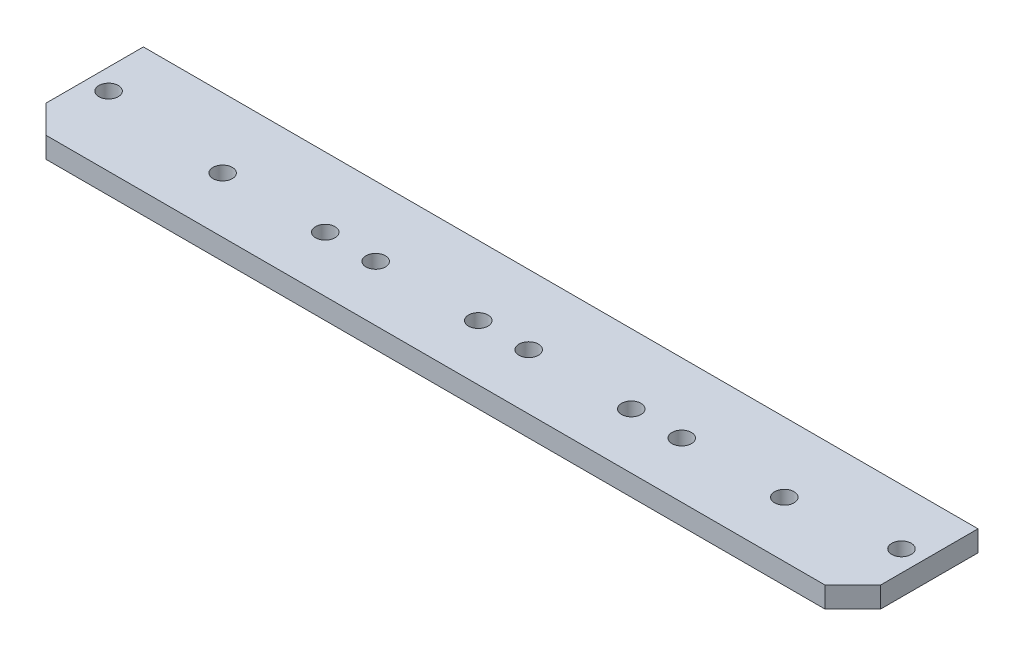
ISO-10303-21;
HEADER;
FILE_DESCRIPTION(('STEP AP214'),'2;1');
FILE_NAME('part.step','',(''),(''),'','','');
FILE_SCHEMA(('AUTOMOTIVE_DESIGN { 1 0 10303 214 1 1 1 1 }'));
ENDSEC;
DATA;
#1=APPLICATION_CONTEXT('core data for automotive mechanical design processes');
#2=APPLICATION_PROTOCOL_DEFINITION('international standard','automotive_design',2000,#1);
#3=PRODUCT_CONTEXT('',#1,'mechanical');
#4=PRODUCT('Part','Part','',(#3));
#5=PRODUCT_RELATED_PRODUCT_CATEGORY('part','',(#4));
#6=PRODUCT_DEFINITION_FORMATION('','',#4);
#7=PRODUCT_DEFINITION_CONTEXT('part definition',#1,'design');
#8=PRODUCT_DEFINITION('design','',#6,#7);
#9=PRODUCT_DEFINITION_SHAPE('','',#8);
#10=(LENGTH_UNIT() NAMED_UNIT(*) SI_UNIT(.MILLI.,.METRE.));
#11=(NAMED_UNIT(*) PLANE_ANGLE_UNIT() SI_UNIT($,.RADIAN.));
#12=(NAMED_UNIT(*) SI_UNIT($,.STERADIAN.) SOLID_ANGLE_UNIT());
#13=UNCERTAINTY_MEASURE_WITH_UNIT(LENGTH_MEASURE(1.E-05),#10,'distance_accuracy_value','');
#14=(GEOMETRIC_REPRESENTATION_CONTEXT(3) GLOBAL_UNCERTAINTY_ASSIGNED_CONTEXT((#13)) GLOBAL_UNIT_ASSIGNED_CONTEXT((#10,
#11,#12)) REPRESENTATION_CONTEXT('',''));
#15=CARTESIAN_POINT('',(0.,0.,0.));
#16=DIRECTION('',(0.,0.,1.));
#17=DIRECTION('',(1.,0.,0.));
#18=AXIS2_PLACEMENT_3D('',#15,#16,#17);
#19=CARTESIAN_POINT('',(60.,3.,-17.5));
#20=DIRECTION('',(-1.,0.,0.));
#21=DIRECTION('',(0.,0.,1.));
#22=AXIS2_PLACEMENT_3D('',#19,#20,#21);
#23=PLANE('',#22);
#24=DIRECTION('',(0.,0.,-1.));
#25=VECTOR('',#24,1.);
#26=CARTESIAN_POINT('',(60.,0.,-17.5));
#27=LINE('',#26,#25);
#28=CARTESIAN_POINT('',(60.,0.,13.5));
#29=VERTEX_POINT('',#28);
#30=CARTESIAN_POINT('',(60.,0.,-0.499999999999995));
#31=VERTEX_POINT('',#30);
#32=EDGE_CURVE('E99',#29,#31,#27,.T.);
#33=ORIENTED_EDGE('',*,*,#32,.T.);
#34=DIRECTION('',(0.,1.,0.));
#35=VECTOR('',#34,1.);
#36=CARTESIAN_POINT('',(60.,0.,-0.499999999999995));
#37=LINE('',#36,#35);
#38=CARTESIAN_POINT('',(60.,3.,-0.499999999999995));
#39=VERTEX_POINT('',#38);
#40=EDGE_CURVE('E94',#31,#39,#37,.T.);
#41=ORIENTED_EDGE('',*,*,#40,.T.);
#42=DIRECTION('',(0.,0.,-1.));
#43=VECTOR('',#42,1.);
#44=CARTESIAN_POINT('',(60.,3.,-17.5));
#45=LINE('',#44,#43);
#46=CARTESIAN_POINT('',(60.,3.,13.5));
#47=VERTEX_POINT('',#46);
#48=EDGE_CURVE('E113',#47,#39,#45,.T.);
#49=ORIENTED_EDGE('',*,*,#48,.F.);
#50=DIRECTION('',(0.,-1.,0.));
#51=VECTOR('',#50,1.);
#52=CARTESIAN_POINT('',(60.,3.,13.5));
#53=LINE('',#52,#51);
#54=EDGE_CURVE('E118',#47,#29,#53,.T.);
#55=ORIENTED_EDGE('',*,*,#54,.T.);
#56=EDGE_LOOP('',(#33,#41,#49,#55));
#57=FACE_BOUND('',#56,.T.);
#58=ADVANCED_FACE('F35',(#57),#23,.F.);
#59=CARTESIAN_POINT('',(-60.,3.,-17.5));
#60=DIRECTION('',(1.,0.,0.));
#61=DIRECTION('',(0.,0.,-1.));
#62=AXIS2_PLACEMENT_3D('',#59,#60,#61);
#63=PLANE('',#62);
#64=DIRECTION('',(0.,0.,1.));
#65=VECTOR('',#64,1.);
#66=CARTESIAN_POINT('',(-60.,3.,-17.5));
#67=LINE('',#66,#65);
#68=CARTESIAN_POINT('',(-60.,3.,-0.499999999999995));
#69=VERTEX_POINT('',#68);
#70=CARTESIAN_POINT('',(-60.,3.,13.5));
#71=VERTEX_POINT('',#70);
#72=EDGE_CURVE('E50',#69,#71,#67,.T.);
#73=ORIENTED_EDGE('',*,*,#72,.F.);
#74=DIRECTION('',(0.,1.,0.));
#75=VECTOR('',#74,1.);
#76=CARTESIAN_POINT('',(-60.,0.,-0.499999999999995));
#77=LINE('',#76,#75);
#78=CARTESIAN_POINT('',(-60.,0.,-0.499999999999995));
#79=VERTEX_POINT('',#78);
#80=EDGE_CURVE('E92',#79,#69,#77,.T.);
#81=ORIENTED_EDGE('',*,*,#80,.F.);
#82=DIRECTION('',(0.,0.,1.));
#83=VECTOR('',#82,1.);
#84=CARTESIAN_POINT('',(-60.,0.,-17.5));
#85=LINE('',#84,#83);
#86=CARTESIAN_POINT('',(-60.,0.,13.5));
#87=VERTEX_POINT('',#86);
#88=EDGE_CURVE('E104',#79,#87,#85,.T.);
#89=ORIENTED_EDGE('',*,*,#88,.T.);
#90=DIRECTION('',(0.,1.,0.));
#91=VECTOR('',#90,1.);
#92=CARTESIAN_POINT('',(-60.,3.,13.5));
#93=LINE('',#92,#91);
#94=EDGE_CURVE('E11',#87,#71,#93,.T.);
#95=ORIENTED_EDGE('',*,*,#94,.T.);
#96=EDGE_LOOP('',(#73,#81,#89,#95));
#97=FACE_BOUND('',#96,.T.);
#98=ADVANCED_FACE('F103',(#97),#63,.F.);
#99=CARTESIAN_POINT('',(-60.,3.,17.5));
#100=DIRECTION('',(0.,0.,-1.));
#101=DIRECTION('',(-1.,0.,0.));
#102=AXIS2_PLACEMENT_3D('',#99,#100,#101);
#103=PLANE('',#102);
#104=DIRECTION('',(1.,0.,0.));
#105=VECTOR('',#104,1.);
#106=CARTESIAN_POINT('',(-60.,0.,17.5));
#107=LINE('',#106,#105);
#108=CARTESIAN_POINT('',(-56.,0.,17.5));
#109=VERTEX_POINT('',#108);
#110=CARTESIAN_POINT('',(56.,0.,17.5));
#111=VERTEX_POINT('',#110);
#112=EDGE_CURVE('E111',#109,#111,#107,.T.);
#113=ORIENTED_EDGE('',*,*,#112,.T.);
#114=DIRECTION('',(0.,1.,0.));
#115=VECTOR('',#114,1.);
#116=CARTESIAN_POINT('',(56.,3.,17.5));
#117=LINE('',#116,#115);
#118=CARTESIAN_POINT('',(56.,3.,17.5));
#119=VERTEX_POINT('',#118);
#120=EDGE_CURVE('E57',#111,#119,#117,.T.);
#121=ORIENTED_EDGE('',*,*,#120,.T.);
#122=DIRECTION('',(1.,0.,0.));
#123=VECTOR('',#122,1.);
#124=CARTESIAN_POINT('',(-60.,3.,17.5));
#125=LINE('',#124,#123);
#126=CARTESIAN_POINT('',(-56.,3.,17.5));
#127=VERTEX_POINT('',#126);
#128=EDGE_CURVE('E121',#127,#119,#125,.T.);
#129=ORIENTED_EDGE('',*,*,#128,.F.);
#130=DIRECTION('',(0.,-1.,0.));
#131=VECTOR('',#130,1.);
#132=CARTESIAN_POINT('',(-56.,3.,17.5));
#133=LINE('',#132,#131);
#134=EDGE_CURVE('E125',#127,#109,#133,.T.);
#135=ORIENTED_EDGE('',*,*,#134,.T.);
#136=EDGE_LOOP('',(#113,#121,#129,#135));
#137=FACE_BOUND('',#136,.T.);
#138=ADVANCED_FACE('F140',(#137),#103,.F.);
#139=CARTESIAN_POINT('',(0.,3.,0.));
#140=DIRECTION('',(0.,1.,0.));
#141=DIRECTION('',(0.,0.,1.));
#142=AXIS2_PLACEMENT_3D('',#139,#140,#141);
#143=PLANE('',#142);
#144=DIRECTION('',(1.,0.,0.));
#145=VECTOR('',#144,1.);
#146=CARTESIAN_POINT('',(-15.,3.,-0.499999999999993));
#147=LINE('',#146,#145);
#148=EDGE_CURVE('E100',#69,#39,#147,.T.);
#149=ORIENTED_EDGE('',*,*,#148,.F.);
#150=ORIENTED_EDGE('',*,*,#72,.T.);
#151=DIRECTION('',(-0.707106781186546,0.,-0.707106781186549));
#152=VECTOR('',#151,1.);
#153=CARTESIAN_POINT('',(-36.7500000000001,3.,36.75));
#154=LINE('',#153,#152);
#155=EDGE_CURVE('E129',#71,#127,#154,.F.);
#156=ORIENTED_EDGE('',*,*,#155,.T.);
#157=ORIENTED_EDGE('',*,*,#128,.T.);
#158=DIRECTION('',(-0.707106781186549,0.,0.707106781186546));
#159=VECTOR('',#158,1.);
#160=CARTESIAN_POINT('',(36.7499999999999,3.,36.75));
#161=LINE('',#160,#159);
#162=EDGE_CURVE('E43',#119,#47,#161,.F.);
#163=ORIENTED_EDGE('',*,*,#162,.T.);
#164=ORIENTED_EDGE('',*,*,#48,.T.);
#165=EDGE_LOOP('',(#149,#150,#156,#157,#163,#164));
#166=FACE_BOUND('',#165,.T.);
#167=CARTESIAN_POINT('',(20.15,3.,9.5));
#168=DIRECTION('',(0.,1.,0.));
#169=DIRECTION('',(0.,0.,1.));
#170=AXIS2_PLACEMENT_3D('',#167,#168,#169);
#171=CIRCLE('',#170,1.4);
#172=CARTESIAN_POINT('',(20.15,3.,10.9));
#173=VERTEX_POINT('',#172);
#174=EDGE_CURVE('E211',#173,#173,#171,.T.);
#175=ORIENTED_EDGE('',*,*,#174,.F.);
#176=EDGE_LOOP('',(#175));
#177=FACE_BOUND('',#176,.T.);
#178=CARTESIAN_POINT('',(27.4,3.,9.50000000000001));
#179=DIRECTION('',(0.,1.,0.));
#180=DIRECTION('',(0.,0.,1.));
#181=AXIS2_PLACEMENT_3D('',#178,#179,#180);
#182=CIRCLE('',#181,1.4);
#183=CARTESIAN_POINT('',(27.4,3.,10.9));
#184=VERTEX_POINT('',#183);
#185=EDGE_CURVE('E217',#184,#184,#182,.T.);
#186=ORIENTED_EDGE('',*,*,#185,.F.);
#187=EDGE_LOOP('',(#186));
#188=FACE_BOUND('',#187,.T.);
#189=CARTESIAN_POINT('',(42.15,3.,9.50000000000001));
#190=DIRECTION('',(0.,1.,0.));
#191=DIRECTION('',(0.,0.,1.));
#192=AXIS2_PLACEMENT_3D('',#189,#190,#191);
#193=CIRCLE('',#192,1.4);
#194=CARTESIAN_POINT('',(42.15,3.,10.9));
#195=VERTEX_POINT('',#194);
#196=EDGE_CURVE('E225',#195,#195,#193,.T.);
#197=ORIENTED_EDGE('',*,*,#196,.F.);
#198=EDGE_LOOP('',(#197));
#199=FACE_BOUND('',#198,.T.);
#200=CARTESIAN_POINT('',(-1.85,3.,9.5));
#201=DIRECTION('',(0.,1.,0.));
#202=DIRECTION('',(0.,0.,1.));
#203=AXIS2_PLACEMENT_3D('',#200,#201,#202);
#204=CIRCLE('',#203,1.4);
#205=CARTESIAN_POINT('',(-1.85,3.,10.9));
#206=VERTEX_POINT('',#205);
#207=EDGE_CURVE('E231',#206,#206,#204,.T.);
#208=ORIENTED_EDGE('',*,*,#207,.F.);
#209=EDGE_LOOP('',(#208));
#210=FACE_BOUND('',#209,.T.);
#211=CARTESIAN_POINT('',(-16.6,3.,9.50000000000001));
#212=DIRECTION('',(0.,1.,0.));
#213=DIRECTION('',(0.,0.,1.));
#214=AXIS2_PLACEMENT_3D('',#211,#212,#213);
#215=CIRCLE('',#214,1.4);
#216=CARTESIAN_POINT('',(-16.6,3.,10.9));
#217=VERTEX_POINT('',#216);
#218=EDGE_CURVE('E237',#217,#217,#215,.T.);
#219=ORIENTED_EDGE('',*,*,#218,.F.);
#220=EDGE_LOOP('',(#219));
#221=FACE_BOUND('',#220,.T.);
#222=CARTESIAN_POINT('',(-23.85,3.,9.50000000000001));
#223=DIRECTION('',(0.,1.,0.));
#224=DIRECTION('',(0.,0.,1.));
#225=AXIS2_PLACEMENT_3D('',#222,#223,#224);
#226=CIRCLE('',#225,1.4);
#227=CARTESIAN_POINT('',(-23.85,3.,10.9));
#228=VERTEX_POINT('',#227);
#229=EDGE_CURVE('E243',#228,#228,#226,.T.);
#230=ORIENTED_EDGE('',*,*,#229,.F.);
#231=EDGE_LOOP('',(#230));
#232=FACE_BOUND('',#231,.T.);
#233=CARTESIAN_POINT('',(-38.6,3.,9.5));
#234=DIRECTION('',(0.,1.,0.));
#235=DIRECTION('',(0.,0.,1.));
#236=AXIS2_PLACEMENT_3D('',#233,#234,#235);
#237=CIRCLE('',#236,1.4);
#238=CARTESIAN_POINT('',(-38.6,3.,10.9));
#239=VERTEX_POINT('',#238);
#240=EDGE_CURVE('E249',#239,#239,#237,.T.);
#241=ORIENTED_EDGE('',*,*,#240,.F.);
#242=EDGE_LOOP('',(#241));
#243=FACE_BOUND('',#242,.T.);
#244=CARTESIAN_POINT('',(5.4,3.,9.50000000000001));
#245=DIRECTION('',(0.,1.,0.));
#246=DIRECTION('',(0.,0.,1.));
#247=AXIS2_PLACEMENT_3D('',#244,#245,#246);
#248=CIRCLE('',#247,1.4);
#249=CARTESIAN_POINT('',(5.4,3.,10.9));
#250=VERTEX_POINT('',#249);
#251=EDGE_CURVE('E214',#250,#250,#248,.T.);
#252=ORIENTED_EDGE('',*,*,#251,.F.);
#253=EDGE_LOOP('',(#252));
#254=FACE_BOUND('',#253,.T.);
#255=CARTESIAN_POINT('',(-57.,3.,7.50000000000001));
#256=DIRECTION('',(0.,1.,0.));
#257=DIRECTION('',(0.,0.,1.));
#258=AXIS2_PLACEMENT_3D('',#255,#256,#257);
#259=CIRCLE('',#258,1.4);
#260=CARTESIAN_POINT('',(-57.,3.,8.9));
#261=VERTEX_POINT('',#260);
#262=EDGE_CURVE('E261',#261,#261,#259,.T.);
#263=ORIENTED_EDGE('',*,*,#262,.F.);
#264=EDGE_LOOP('',(#263));
#265=FACE_BOUND('',#264,.T.);
#266=CARTESIAN_POINT('',(57.,3.,7.50000000000001));
#267=DIRECTION('',(0.,1.,0.));
#268=DIRECTION('',(0.,0.,-1.));
#269=AXIS2_PLACEMENT_3D('',#266,#267,#268);
#270=CIRCLE('',#269,1.4);
#271=CARTESIAN_POINT('',(57.,3.,6.10000000000001));
#272=VERTEX_POINT('',#271);
#273=EDGE_CURVE('E255',#272,#272,#270,.T.);
#274=ORIENTED_EDGE('',*,*,#273,.F.);
#275=EDGE_LOOP('',(#274));
#276=FACE_BOUND('',#275,.T.);
#277=ADVANCED_FACE('F133',(#166,#177,#188,#199,#210,#221,#232,#243,#254,#265,#276),#143,.T.);
#278=CARTESIAN_POINT('',(0.,0.,0.));
#279=DIRECTION('',(0.,1.,0.));
#280=DIRECTION('',(0.,0.,1.));
#281=AXIS2_PLACEMENT_3D('',#278,#279,#280);
#282=PLANE('',#281);
#283=CARTESIAN_POINT('',(20.15,0.,9.5));
#284=DIRECTION('',(0.,1.,0.));
#285=DIRECTION('',(0.,0.,1.));
#286=AXIS2_PLACEMENT_3D('',#283,#284,#285);
#287=CIRCLE('',#286,1.4);
#288=CARTESIAN_POINT('',(20.15,0.,10.9));
#289=VERTEX_POINT('',#288);
#290=EDGE_CURVE('E208',#289,#289,#287,.T.);
#291=ORIENTED_EDGE('',*,*,#290,.T.);
#292=EDGE_LOOP('',(#291));
#293=FACE_BOUND('',#292,.T.);
#294=CARTESIAN_POINT('',(27.4,0.,9.50000000000001));
#295=DIRECTION('',(0.,1.,0.));
#296=DIRECTION('',(0.,0.,1.));
#297=AXIS2_PLACEMENT_3D('',#294,#295,#296);
#298=CIRCLE('',#297,1.4);
#299=CARTESIAN_POINT('',(27.4,0.,10.9));
#300=VERTEX_POINT('',#299);
#301=EDGE_CURVE('E212',#300,#300,#298,.T.);
#302=ORIENTED_EDGE('',*,*,#301,.T.);
#303=EDGE_LOOP('',(#302));
#304=FACE_BOUND('',#303,.T.);
#305=CARTESIAN_POINT('',(42.15,0.,9.50000000000001));
#306=DIRECTION('',(0.,1.,0.));
#307=DIRECTION('',(0.,0.,1.));
#308=AXIS2_PLACEMENT_3D('',#305,#306,#307);
#309=CIRCLE('',#308,1.4);
#310=CARTESIAN_POINT('',(42.15,0.,10.9));
#311=VERTEX_POINT('',#310);
#312=EDGE_CURVE('E222',#311,#311,#309,.T.);
#313=ORIENTED_EDGE('',*,*,#312,.T.);
#314=EDGE_LOOP('',(#313));
#315=FACE_BOUND('',#314,.T.);
#316=CARTESIAN_POINT('',(-1.85,0.,9.5));
#317=DIRECTION('',(0.,1.,0.));
#318=DIRECTION('',(0.,0.,1.));
#319=AXIS2_PLACEMENT_3D('',#316,#317,#318);
#320=CIRCLE('',#319,1.4);
#321=CARTESIAN_POINT('',(-1.85,0.,10.9));
#322=VERTEX_POINT('',#321);
#323=EDGE_CURVE('E228',#322,#322,#320,.T.);
#324=ORIENTED_EDGE('',*,*,#323,.T.);
#325=EDGE_LOOP('',(#324));
#326=FACE_BOUND('',#325,.T.);
#327=CARTESIAN_POINT('',(-16.6,0.,9.50000000000001));
#328=DIRECTION('',(0.,1.,0.));
#329=DIRECTION('',(0.,0.,1.));
#330=AXIS2_PLACEMENT_3D('',#327,#328,#329);
#331=CIRCLE('',#330,1.4);
#332=CARTESIAN_POINT('',(-16.6,0.,10.9));
#333=VERTEX_POINT('',#332);
#334=EDGE_CURVE('E234',#333,#333,#331,.T.);
#335=ORIENTED_EDGE('',*,*,#334,.T.);
#336=EDGE_LOOP('',(#335));
#337=FACE_BOUND('',#336,.T.);
#338=CARTESIAN_POINT('',(-23.85,0.,9.50000000000001));
#339=DIRECTION('',(0.,1.,0.));
#340=DIRECTION('',(0.,0.,1.));
#341=AXIS2_PLACEMENT_3D('',#338,#339,#340);
#342=CIRCLE('',#341,1.4);
#343=CARTESIAN_POINT('',(-23.85,0.,10.9));
#344=VERTEX_POINT('',#343);
#345=EDGE_CURVE('E240',#344,#344,#342,.T.);
#346=ORIENTED_EDGE('',*,*,#345,.T.);
#347=EDGE_LOOP('',(#346));
#348=FACE_BOUND('',#347,.T.);
#349=CARTESIAN_POINT('',(-38.6,0.,9.5));
#350=DIRECTION('',(0.,1.,0.));
#351=DIRECTION('',(0.,0.,1.));
#352=AXIS2_PLACEMENT_3D('',#349,#350,#351);
#353=CIRCLE('',#352,1.4);
#354=CARTESIAN_POINT('',(-38.6,0.,10.9));
#355=VERTEX_POINT('',#354);
#356=EDGE_CURVE('E246',#355,#355,#353,.T.);
#357=ORIENTED_EDGE('',*,*,#356,.T.);
#358=EDGE_LOOP('',(#357));
#359=FACE_BOUND('',#358,.T.);
#360=CARTESIAN_POINT('',(5.4,0.,9.50000000000001));
#361=DIRECTION('',(0.,1.,0.));
#362=DIRECTION('',(0.,0.,1.));
#363=AXIS2_PLACEMENT_3D('',#360,#361,#362);
#364=CIRCLE('',#363,1.4);
#365=CARTESIAN_POINT('',(5.4,0.,10.9));
#366=VERTEX_POINT('',#365);
#367=EDGE_CURVE('E252',#366,#366,#364,.T.);
#368=ORIENTED_EDGE('',*,*,#367,.T.);
#369=EDGE_LOOP('',(#368));
#370=FACE_BOUND('',#369,.T.);
#371=CARTESIAN_POINT('',(-57.,0.,7.50000000000001));
#372=DIRECTION('',(0.,1.,0.));
#373=DIRECTION('',(0.,0.,1.));
#374=AXIS2_PLACEMENT_3D('',#371,#372,#373);
#375=CIRCLE('',#374,1.4);
#376=CARTESIAN_POINT('',(-57.,0.,8.9));
#377=VERTEX_POINT('',#376);
#378=EDGE_CURVE('E258',#377,#377,#375,.T.);
#379=ORIENTED_EDGE('',*,*,#378,.T.);
#380=EDGE_LOOP('',(#379));
#381=FACE_BOUND('',#380,.T.);
#382=CARTESIAN_POINT('',(57.,0.,7.50000000000001));
#383=DIRECTION('',(0.,1.,0.));
#384=DIRECTION('',(0.,0.,-1.));
#385=AXIS2_PLACEMENT_3D('',#382,#383,#384);
#386=CIRCLE('',#385,1.4);
#387=CARTESIAN_POINT('',(57.,0.,6.10000000000001));
#388=VERTEX_POINT('',#387);
#389=EDGE_CURVE('E264',#388,#388,#386,.T.);
#390=ORIENTED_EDGE('',*,*,#389,.T.);
#391=EDGE_LOOP('',(#390));
#392=FACE_BOUND('',#391,.T.);
#393=ORIENTED_EDGE('',*,*,#88,.F.);
#394=DIRECTION('',(1.,0.,0.));
#395=VECTOR('',#394,1.);
#396=CARTESIAN_POINT('',(-15.,0.,-0.499999999999993));
#397=LINE('',#396,#395);
#398=EDGE_CURVE('E89',#79,#31,#397,.T.);
#399=ORIENTED_EDGE('',*,*,#398,.T.);
#400=ORIENTED_EDGE('',*,*,#32,.F.);
#401=DIRECTION('',(0.707106781186549,0.,-0.707106781186546));
#402=VECTOR('',#401,1.);
#403=CARTESIAN_POINT('',(60.,0.,13.5));
#404=LINE('',#403,#402);
#405=EDGE_CURVE('E123',#29,#111,#404,.F.);
#406=ORIENTED_EDGE('',*,*,#405,.T.);
#407=ORIENTED_EDGE('',*,*,#112,.F.);
#408=DIRECTION('',(0.707106781186546,0.,0.707106781186549));
#409=VECTOR('',#408,1.);
#410=CARTESIAN_POINT('',(-56.,0.,17.5));
#411=LINE('',#410,#409);
#412=EDGE_CURVE('E109',#109,#87,#411,.F.);
#413=ORIENTED_EDGE('',*,*,#412,.T.);
#414=EDGE_LOOP('',(#393,#399,#400,#406,#407,#413));
#415=FACE_BOUND('',#414,.T.);
#416=ADVANCED_FACE('F107',(#293,#304,#315,#326,#337,#348,#359,#370,#381,#392,#415),#282,.F.);
#417=CARTESIAN_POINT('',(-15.,0.,-0.499999999999993));
#418=DIRECTION('',(0.,0.,1.));
#419=DIRECTION('',(1.,0.,0.));
#420=AXIS2_PLACEMENT_3D('',#417,#418,#419);
#421=PLANE('',#420);
#422=ORIENTED_EDGE('',*,*,#148,.T.);
#423=ORIENTED_EDGE('',*,*,#40,.F.);
#424=ORIENTED_EDGE('',*,*,#398,.F.);
#425=ORIENTED_EDGE('',*,*,#80,.T.);
#426=EDGE_LOOP('',(#422,#423,#424,#425));
#427=FACE_BOUND('',#426,.T.);
#428=ADVANCED_FACE('F91',(#427),#421,.F.);
#429=CARTESIAN_POINT('',(57.,0.,7.50000000000001));
#430=DIRECTION('',(0.,1.,0.));
#431=DIRECTION('',(0.,0.,1.));
#432=AXIS2_PLACEMENT_3D('',#429,#430,#431);
#433=CYLINDRICAL_SURFACE('',#432,1.4);
#434=ORIENTED_EDGE('',*,*,#389,.F.);
#435=EDGE_LOOP('',(#434));
#436=FACE_BOUND('',#435,.T.);
#437=ORIENTED_EDGE('',*,*,#273,.T.);
#438=EDGE_LOOP('',(#437));
#439=FACE_BOUND('',#438,.T.);
#440=ADVANCED_FACE('F165',(#436,#439),#433,.F.);
#441=CARTESIAN_POINT('',(-57.,0.,7.50000000000001));
#442=DIRECTION('',(0.,1.,0.));
#443=DIRECTION('',(0.,0.,1.));
#444=AXIS2_PLACEMENT_3D('',#441,#442,#443);
#445=CYLINDRICAL_SURFACE('',#444,1.4);
#446=ORIENTED_EDGE('',*,*,#378,.F.);
#447=EDGE_LOOP('',(#446));
#448=FACE_BOUND('',#447,.T.);
#449=ORIENTED_EDGE('',*,*,#262,.T.);
#450=EDGE_LOOP('',(#449));
#451=FACE_BOUND('',#450,.T.);
#452=ADVANCED_FACE('F168',(#448,#451),#445,.F.);
#453=CARTESIAN_POINT('',(5.4,0.,9.50000000000001));
#454=DIRECTION('',(0.,1.,0.));
#455=DIRECTION('',(0.,0.,1.));
#456=AXIS2_PLACEMENT_3D('',#453,#454,#455);
#457=CYLINDRICAL_SURFACE('',#456,1.4);
#458=ORIENTED_EDGE('',*,*,#367,.F.);
#459=EDGE_LOOP('',(#458));
#460=FACE_BOUND('',#459,.T.);
#461=ORIENTED_EDGE('',*,*,#251,.T.);
#462=EDGE_LOOP('',(#461));
#463=FACE_BOUND('',#462,.T.);
#464=ADVANCED_FACE('F172',(#460,#463),#457,.F.);
#465=CARTESIAN_POINT('',(-38.6,0.,9.5));
#466=DIRECTION('',(0.,1.,0.));
#467=DIRECTION('',(0.,0.,1.));
#468=AXIS2_PLACEMENT_3D('',#465,#466,#467);
#469=CYLINDRICAL_SURFACE('',#468,1.4);
#470=ORIENTED_EDGE('',*,*,#356,.F.);
#471=EDGE_LOOP('',(#470));
#472=FACE_BOUND('',#471,.T.);
#473=ORIENTED_EDGE('',*,*,#240,.T.);
#474=EDGE_LOOP('',(#473));
#475=FACE_BOUND('',#474,.T.);
#476=ADVANCED_FACE('F176',(#472,#475),#469,.F.);
#477=CARTESIAN_POINT('',(-23.85,0.,9.50000000000001));
#478=DIRECTION('',(0.,1.,0.));
#479=DIRECTION('',(0.,0.,1.));
#480=AXIS2_PLACEMENT_3D('',#477,#478,#479);
#481=CYLINDRICAL_SURFACE('',#480,1.4);
#482=ORIENTED_EDGE('',*,*,#345,.F.);
#483=EDGE_LOOP('',(#482));
#484=FACE_BOUND('',#483,.T.);
#485=ORIENTED_EDGE('',*,*,#229,.T.);
#486=EDGE_LOOP('',(#485));
#487=FACE_BOUND('',#486,.T.);
#488=ADVANCED_FACE('F180',(#484,#487),#481,.F.);
#489=CARTESIAN_POINT('',(-16.6,0.,9.50000000000001));
#490=DIRECTION('',(0.,1.,0.));
#491=DIRECTION('',(0.,0.,1.));
#492=AXIS2_PLACEMENT_3D('',#489,#490,#491);
#493=CYLINDRICAL_SURFACE('',#492,1.4);
#494=ORIENTED_EDGE('',*,*,#334,.F.);
#495=EDGE_LOOP('',(#494));
#496=FACE_BOUND('',#495,.T.);
#497=ORIENTED_EDGE('',*,*,#218,.T.);
#498=EDGE_LOOP('',(#497));
#499=FACE_BOUND('',#498,.T.);
#500=ADVANCED_FACE('F184',(#496,#499),#493,.F.);
#501=CARTESIAN_POINT('',(-1.85,0.,9.5));
#502=DIRECTION('',(0.,1.,0.));
#503=DIRECTION('',(0.,0.,1.));
#504=AXIS2_PLACEMENT_3D('',#501,#502,#503);
#505=CYLINDRICAL_SURFACE('',#504,1.4);
#506=ORIENTED_EDGE('',*,*,#323,.F.);
#507=EDGE_LOOP('',(#506));
#508=FACE_BOUND('',#507,.T.);
#509=ORIENTED_EDGE('',*,*,#207,.T.);
#510=EDGE_LOOP('',(#509));
#511=FACE_BOUND('',#510,.T.);
#512=ADVANCED_FACE('F188',(#508,#511),#505,.F.);
#513=CARTESIAN_POINT('',(42.15,0.,9.50000000000001));
#514=DIRECTION('',(0.,1.,0.));
#515=DIRECTION('',(0.,0.,1.));
#516=AXIS2_PLACEMENT_3D('',#513,#514,#515);
#517=CYLINDRICAL_SURFACE('',#516,1.4);
#518=ORIENTED_EDGE('',*,*,#312,.F.);
#519=EDGE_LOOP('',(#518));
#520=FACE_BOUND('',#519,.T.);
#521=ORIENTED_EDGE('',*,*,#196,.T.);
#522=EDGE_LOOP('',(#521));
#523=FACE_BOUND('',#522,.T.);
#524=ADVANCED_FACE('F192',(#520,#523),#517,.F.);
#525=CARTESIAN_POINT('',(27.4,0.,9.50000000000001));
#526=DIRECTION('',(0.,1.,0.));
#527=DIRECTION('',(0.,0.,1.));
#528=AXIS2_PLACEMENT_3D('',#525,#526,#527);
#529=CYLINDRICAL_SURFACE('',#528,1.4);
#530=ORIENTED_EDGE('',*,*,#301,.F.);
#531=EDGE_LOOP('',(#530));
#532=FACE_BOUND('',#531,.T.);
#533=ORIENTED_EDGE('',*,*,#185,.T.);
#534=EDGE_LOOP('',(#533));
#535=FACE_BOUND('',#534,.T.);
#536=ADVANCED_FACE('F196',(#532,#535),#529,.F.);
#537=CARTESIAN_POINT('',(20.15,0.,9.5));
#538=DIRECTION('',(0.,1.,0.));
#539=DIRECTION('',(0.,0.,1.));
#540=AXIS2_PLACEMENT_3D('',#537,#538,#539);
#541=CYLINDRICAL_SURFACE('',#540,1.4);
#542=ORIENTED_EDGE('',*,*,#290,.F.);
#543=EDGE_LOOP('',(#542));
#544=FACE_BOUND('',#543,.T.);
#545=ORIENTED_EDGE('',*,*,#174,.T.);
#546=EDGE_LOOP('',(#545));
#547=FACE_BOUND('',#546,.T.);
#548=ADVANCED_FACE('F148',(#544,#547),#541,.F.);
#549=CARTESIAN_POINT('',(60.,3.,13.5));
#550=DIRECTION('',(-0.707106781186546,0.,-0.707106781186549));
#551=DIRECTION('',(0.,-1.,0.));
#552=AXIS2_PLACEMENT_3D('',#549,#550,#551);
#553=PLANE('',#552);
#554=ORIENTED_EDGE('',*,*,#162,.F.);
#555=ORIENTED_EDGE('',*,*,#120,.F.);
#556=ORIENTED_EDGE('',*,*,#405,.F.);
#557=ORIENTED_EDGE('',*,*,#54,.F.);
#558=EDGE_LOOP('',(#554,#555,#556,#557));
#559=FACE_BOUND('',#558,.T.);
#560=ADVANCED_FACE('F139',(#559),#553,.F.);
#561=CARTESIAN_POINT('',(-56.,3.,17.5));
#562=DIRECTION('',(0.707106781186549,0.,-0.707106781186546));
#563=DIRECTION('',(0.,-1.,0.));
#564=AXIS2_PLACEMENT_3D('',#561,#562,#563);
#565=PLANE('',#564);
#566=ORIENTED_EDGE('',*,*,#155,.F.);
#567=ORIENTED_EDGE('',*,*,#94,.F.);
#568=ORIENTED_EDGE('',*,*,#412,.F.);
#569=ORIENTED_EDGE('',*,*,#134,.F.);
#570=EDGE_LOOP('',(#566,#567,#568,#569));
#571=FACE_BOUND('',#570,.T.);
#572=ADVANCED_FACE('F37',(#571),#565,.F.);
#573=CLOSED_SHELL('',(#58,#98,#138,#277,#416,#428,#440,#452,#464,#476,#488,#500,#512,#524,#536,
#548,#560,#572));
#574=MANIFOLD_SOLID_BREP('B2',#573);
#575=ADVANCED_BREP_SHAPE_REPRESENTATION('',(#18,#574),#14);
#576=SHAPE_DEFINITION_REPRESENTATION(#9,#575);
ENDSEC;
END-ISO-10303-21;
